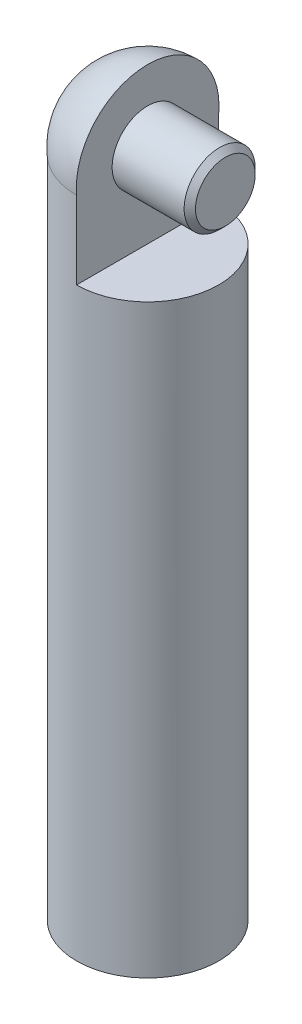
ISO-10303-21;
HEADER;
FILE_DESCRIPTION(('STEP AP214'),'2;1');
FILE_NAME('part.step','',(''),(''),'','','');
FILE_SCHEMA(('AUTOMOTIVE_DESIGN { 1 0 10303 214 1 1 1 1 }'));
ENDSEC;
DATA;
#1=APPLICATION_CONTEXT('core data for automotive mechanical design processes');
#2=APPLICATION_PROTOCOL_DEFINITION('international standard','automotive_design',2000,#1);
#3=PRODUCT_CONTEXT('',#1,'mechanical');
#4=PRODUCT('Part','Part','',(#3));
#5=PRODUCT_RELATED_PRODUCT_CATEGORY('part','',(#4));
#6=PRODUCT_DEFINITION_FORMATION('','',#4);
#7=PRODUCT_DEFINITION_CONTEXT('part definition',#1,'design');
#8=PRODUCT_DEFINITION('design','',#6,#7);
#9=PRODUCT_DEFINITION_SHAPE('','',#8);
#10=(LENGTH_UNIT() NAMED_UNIT(*) SI_UNIT(.MILLI.,.METRE.));
#11=(NAMED_UNIT(*) PLANE_ANGLE_UNIT() SI_UNIT($,.RADIAN.));
#12=(NAMED_UNIT(*) SI_UNIT($,.STERADIAN.) SOLID_ANGLE_UNIT());
#13=UNCERTAINTY_MEASURE_WITH_UNIT(LENGTH_MEASURE(1.E-05),#10,'distance_accuracy_value','');
#14=(GEOMETRIC_REPRESENTATION_CONTEXT(3) GLOBAL_UNCERTAINTY_ASSIGNED_CONTEXT((#13)) GLOBAL_UNIT_ASSIGNED_CONTEXT((#10,
#11,#12)) REPRESENTATION_CONTEXT('',''));
#15=CARTESIAN_POINT('',(0.,0.,0.));
#16=DIRECTION('',(0.,0.,1.));
#17=DIRECTION('',(1.,0.,0.));
#18=AXIS2_PLACEMENT_3D('',#15,#16,#17);
#19=CARTESIAN_POINT('',(0.,177.8,0.));
#20=DIRECTION('',(0.,-1.,0.));
#21=DIRECTION('',(0.,0.,-1.));
#22=AXIS2_PLACEMENT_3D('',#19,#20,#21);
#23=CYLINDRICAL_SURFACE('',#22,19.05);
#24=CARTESIAN_POINT('',(0.,177.8,0.));
#25=DIRECTION('',(0.,1.,0.));
#26=DIRECTION('',(0.,0.,1.));
#27=AXIS2_PLACEMENT_3D('',#24,#25,#26);
#28=CIRCLE('',#27,19.05);
#29=CARTESIAN_POINT('',(0.,177.8,-19.05));
#30=VERTEX_POINT('',#29);
#31=CARTESIAN_POINT('',(0.,177.8,19.05));
#32=VERTEX_POINT('',#31);
#33=EDGE_CURVE('E73',#30,#32,#28,.T.);
#34=ORIENTED_EDGE('',*,*,#33,.F.);
#35=DIRECTION('',(0.,-1.,0.));
#36=VECTOR('',#35,1.);
#37=CARTESIAN_POINT('',(0.,177.8,-19.05));
#38=LINE('',#37,#36);
#39=CARTESIAN_POINT('',(0.,156.972,-19.05));
#40=VERTEX_POINT('',#39);
#41=EDGE_CURVE('E48',#30,#40,#38,.T.);
#42=ORIENTED_EDGE('',*,*,#41,.T.);
#43=CARTESIAN_POINT('',(0.,156.972,0.));
#44=DIRECTION('',(0.,-1.,0.));
#45=DIRECTION('',(0.,0.,-1.));
#46=AXIS2_PLACEMENT_3D('',#43,#44,#45);
#47=CIRCLE('',#46,19.05);
#48=CARTESIAN_POINT('',(0.,156.972,19.05));
#49=VERTEX_POINT('',#48);
#50=EDGE_CURVE('E61',#40,#49,#47,.T.);
#51=ORIENTED_EDGE('',*,*,#50,.T.);
#52=DIRECTION('',(0.,-1.,0.));
#53=VECTOR('',#52,1.);
#54=CARTESIAN_POINT('',(0.,177.8,19.05));
#55=LINE('',#54,#53);
#56=EDGE_CURVE('E68',#49,#32,#55,.F.);
#57=ORIENTED_EDGE('',*,*,#56,.T.);
#58=EDGE_LOOP('',(#34,#42,#51,#57));
#59=FACE_BOUND('',#58,.T.);
#60=CARTESIAN_POINT('',(0.,0.,0.));
#61=DIRECTION('',(0.,1.,0.));
#62=DIRECTION('',(0.,0.,1.));
#63=AXIS2_PLACEMENT_3D('',#60,#61,#62);
#64=CIRCLE('',#63,19.05);
#65=CARTESIAN_POINT('',(0.,0.,19.05));
#66=VERTEX_POINT('',#65);
#67=EDGE_CURVE('E75',#66,#66,#64,.T.);
#68=ORIENTED_EDGE('',*,*,#67,.T.);
#69=EDGE_LOOP('',(#68));
#70=FACE_BOUND('',#69,.T.);
#71=ADVANCED_FACE('F33',(#59,#70),#23,.T.);
#72=CARTESIAN_POINT('',(0.,179.502109756098,0.));
#73=DIRECTION('',(0.,0.,1.));
#74=DIRECTION('',(1.,0.,0.));
#75=AXIS2_PLACEMENT_3D('',#72,#73,#74);
#76=SPHERICAL_SURFACE('',#75,19.1258902439024);
#77=ORIENTED_EDGE('',*,*,#33,.T.);
#78=CARTESIAN_POINT('',(0.,179.502109756098,0.));
#79=DIRECTION('',(-1.,0.,0.));
#80=DIRECTION('',(0.,-1.,0.));
#81=AXIS2_PLACEMENT_3D('',#78,#79,#80);
#82=CIRCLE('',#81,19.1258902439024);
#83=EDGE_CURVE('E52',#30,#32,#82,.F.);
#84=ORIENTED_EDGE('',*,*,#83,.F.);
#85=EDGE_LOOP('',(#77,#84));
#86=FACE_BOUND('',#85,.T.);
#87=ADVANCED_FACE('F97',(#86),#76,.T.);
#88=CARTESIAN_POINT('',(0.,0.,0.));
#89=DIRECTION('',(0.,1.,0.));
#90=DIRECTION('',(0.,0.,1.));
#91=AXIS2_PLACEMENT_3D('',#88,#89,#90);
#92=PLANE('',#91);
#93=ORIENTED_EDGE('',*,*,#67,.F.);
#94=EDGE_LOOP('',(#93));
#95=FACE_BOUND('',#94,.T.);
#96=ADVANCED_FACE('F102',(#95),#92,.F.);
#97=CARTESIAN_POINT('',(0.,156.972,-19.1258902439024));
#98=DIRECTION('',(0.,-1.,0.));
#99=DIRECTION('',(0.,0.,-1.));
#100=AXIS2_PLACEMENT_3D('',#97,#98,#99);
#101=PLANE('',#100);
#102=DIRECTION('',(0.,0.,1.));
#103=VECTOR('',#102,1.);
#104=CARTESIAN_POINT('',(0.,156.972,-19.1258902439024));
#105=LINE('',#104,#103);
#106=EDGE_CURVE('E63',#40,#49,#105,.T.);
#107=ORIENTED_EDGE('',*,*,#106,.T.);
#108=ORIENTED_EDGE('',*,*,#50,.F.);
#109=EDGE_LOOP('',(#107,#108));
#110=FACE_BOUND('',#109,.T.);
#111=ADVANCED_FACE('F62',(#110),#101,.F.);
#112=CARTESIAN_POINT('',(0.,198.628,-19.1258902439024));
#113=DIRECTION('',(-1.,0.,0.));
#114=DIRECTION('',(0.,-1.,0.));
#115=AXIS2_PLACEMENT_3D('',#112,#113,#114);
#116=PLANE('',#115);
#117=CARTESIAN_POINT('',(0.,179.502109756098,0.));
#118=DIRECTION('',(-1.,0.,0.));
#119=DIRECTION('',(0.,-1.,0.));
#120=AXIS2_PLACEMENT_3D('',#117,#118,#119);
#121=CIRCLE('',#120,9.525);
#122=CARTESIAN_POINT('',(0.,169.977109756098,0.));
#123=VERTEX_POINT('',#122);
#124=EDGE_CURVE('E65',#123,#123,#121,.F.);
#125=ORIENTED_EDGE('',*,*,#124,.F.);
#126=EDGE_LOOP('',(#125));
#127=FACE_BOUND('',#126,.T.);
#128=ORIENTED_EDGE('',*,*,#106,.F.);
#129=ORIENTED_EDGE('',*,*,#41,.F.);
#130=ORIENTED_EDGE('',*,*,#83,.T.);
#131=ORIENTED_EDGE('',*,*,#56,.F.);
#132=EDGE_LOOP('',(#128,#129,#130,#131));
#133=FACE_BOUND('',#132,.T.);
#134=ADVANCED_FACE('F67',(#127,#133),#116,.F.);
#135=CARTESIAN_POINT('',(20.828,179.502109756098,0.));
#136=DIRECTION('',(-1.,0.,0.));
#137=DIRECTION('',(0.,-1.,0.));
#138=AXIS2_PLACEMENT_3D('',#135,#136,#137);
#139=CYLINDRICAL_SURFACE('',#138,9.525);
#140=CARTESIAN_POINT('',(19.304,179.502109756098,0.));
#141=DIRECTION('',(1.,0.,0.));
#142=DIRECTION('',(0.,0.,-1.));
#143=AXIS2_PLACEMENT_3D('',#140,#141,#142);
#144=CIRCLE('',#143,9.525);
#145=CARTESIAN_POINT('',(19.304,179.502109756098,-9.525));
#146=VERTEX_POINT('',#145);
#147=EDGE_CURVE('E11',#146,#146,#144,.F.);
#148=ORIENTED_EDGE('',*,*,#147,.T.);
#149=EDGE_LOOP('',(#148));
#150=FACE_BOUND('',#149,.T.);
#151=ORIENTED_EDGE('',*,*,#124,.T.);
#152=EDGE_LOOP('',(#151));
#153=FACE_BOUND('',#152,.T.);
#154=ADVANCED_FACE('F93',(#150,#153),#139,.T.);
#155=CARTESIAN_POINT('',(20.828,179.502109756098,0.));
#156=DIRECTION('',(1.,0.,0.));
#157=DIRECTION('',(0.,1.,0.));
#158=AXIS2_PLACEMENT_3D('',#155,#156,#157);
#159=PLANE('',#158);
#160=CARTESIAN_POINT('',(20.828,179.502109756098,0.));
#161=DIRECTION('',(1.,0.,0.));
#162=DIRECTION('',(0.,1.,0.));
#163=AXIS2_PLACEMENT_3D('',#160,#161,#162);
#164=CIRCLE('',#163,8.00099999999998);
#165=CARTESIAN_POINT('',(20.828,187.503109756098,0.));
#166=VERTEX_POINT('',#165);
#167=EDGE_CURVE('E41',#166,#166,#164,.T.);
#168=ORIENTED_EDGE('',*,*,#167,.T.);
#169=EDGE_LOOP('',(#168));
#170=FACE_BOUND('',#169,.T.);
#171=ADVANCED_FACE('F86',(#170),#159,.T.);
#172=CARTESIAN_POINT('',(20.828,179.502109756098,0.));
#173=DIRECTION('',(-1.,0.,0.));
#174=DIRECTION('',(0.,0.,1.));
#175=AXIS2_PLACEMENT_3D('',#172,#173,#174);
#176=CONICAL_SURFACE('',#175,8.00099999999998,0.78539816339745);
#177=ORIENTED_EDGE('',*,*,#147,.F.);
#178=EDGE_LOOP('',(#177));
#179=FACE_BOUND('',#178,.T.);
#180=ORIENTED_EDGE('',*,*,#167,.F.);
#181=EDGE_LOOP('',(#180));
#182=FACE_BOUND('',#181,.T.);
#183=ADVANCED_FACE('F35',(#179,#182),#176,.T.);
#184=CLOSED_SHELL('',(#71,#87,#96,#111,#134,#154,#171,#183));
#185=MANIFOLD_SOLID_BREP('B2',#184);
#186=ADVANCED_BREP_SHAPE_REPRESENTATION('',(#18,#185),#14);
#187=SHAPE_DEFINITION_REPRESENTATION(#9,#186);
ENDSEC;
END-ISO-10303-21;
